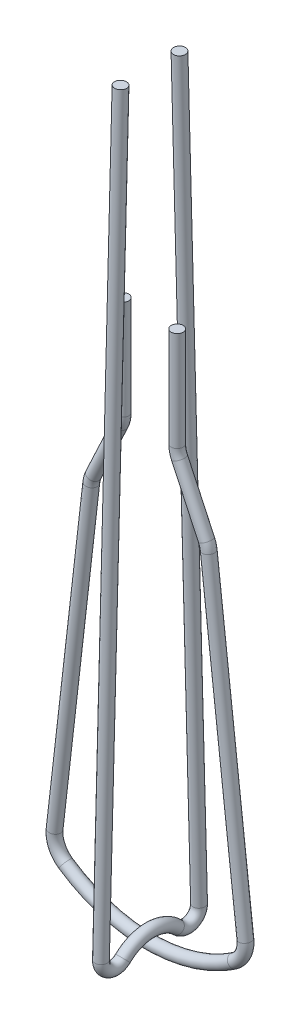
ISO-10303-21;
HEADER;
FILE_DESCRIPTION(('STEP AP214'),'2;1');
FILE_NAME('part.step','',(''),(''),'','','');
FILE_SCHEMA(('AUTOMOTIVE_DESIGN { 1 0 10303 214 1 1 1 1 }'));
ENDSEC;
DATA;
#1=APPLICATION_CONTEXT('core data for automotive mechanical design processes');
#2=APPLICATION_PROTOCOL_DEFINITION('international standard','automotive_design',2000,#1);
#3=PRODUCT_CONTEXT('',#1,'mechanical');
#4=PRODUCT('Part','Part','',(#3));
#5=PRODUCT_RELATED_PRODUCT_CATEGORY('part','',(#4));
#6=PRODUCT_DEFINITION_FORMATION('','',#4);
#7=PRODUCT_DEFINITION_CONTEXT('part definition',#1,'design');
#8=PRODUCT_DEFINITION('design','',#6,#7);
#9=PRODUCT_DEFINITION_SHAPE('','',#8);
#10=(LENGTH_UNIT() NAMED_UNIT(*) SI_UNIT(.MILLI.,.METRE.));
#11=(NAMED_UNIT(*) PLANE_ANGLE_UNIT() SI_UNIT($,.RADIAN.));
#12=(NAMED_UNIT(*) SI_UNIT($,.STERADIAN.) SOLID_ANGLE_UNIT());
#13=UNCERTAINTY_MEASURE_WITH_UNIT(LENGTH_MEASURE(1.E-05),#10,'distance_accuracy_value','');
#14=(GEOMETRIC_REPRESENTATION_CONTEXT(3) GLOBAL_UNCERTAINTY_ASSIGNED_CONTEXT((#13)) GLOBAL_UNIT_ASSIGNED_CONTEXT((#10,
#11,#12)) REPRESENTATION_CONTEXT('',''));
#15=CARTESIAN_POINT('',(0.,0.,0.));
#16=DIRECTION('',(0.,0.,1.));
#17=DIRECTION('',(1.,0.,0.));
#18=AXIS2_PLACEMENT_3D('',#15,#16,#17);
#19=CARTESIAN_POINT('',(6.66749999999998,-5.11109615793453,0.));
#20=DIRECTION('',(0.,1.,0.));
#21=DIRECTION('',(-1.,0.,0.));
#22=AXIS2_PLACEMENT_3D('',#19,#20,#21);
#23=CYLINDRICAL_SURFACE('',#22,1.4605);
#24=CARTESIAN_POINT('',(6.66749999999998,-5.11109615793453,0.));
#25=DIRECTION('',(0.,1.,0.));
#26=DIRECTION('',(-1.,0.,0.));
#27=AXIS2_PLACEMENT_3D('',#24,#25,#26);
#28=CIRCLE('',#27,1.4605);
#29=CARTESIAN_POINT('',(5.20699999999998,-5.11109615793453,0.));
#30=VERTEX_POINT('',#29);
#31=EDGE_CURVE('E49',#30,#30,#28,.T.);
#32=ORIENTED_EDGE('',*,*,#31,.T.);
#33=EDGE_LOOP('',(#32));
#34=FACE_BOUND('',#33,.T.);
#35=CARTESIAN_POINT('',(6.66749999999998,19.2995920488355,0.));
#36=DIRECTION('',(0.,1.,0.));
#37=DIRECTION('',(-1.,0.,0.));
#38=AXIS2_PLACEMENT_3D('',#35,#36,#37);
#39=CIRCLE('',#38,1.4605);
#40=CARTESIAN_POINT('',(5.20699999999998,19.2995920488355,0.));
#41=VERTEX_POINT('',#40);
#42=EDGE_CURVE('E45',#41,#41,#39,.T.);
#43=ORIENTED_EDGE('',*,*,#42,.F.);
#44=EDGE_LOOP('',(#43));
#45=FACE_BOUND('',#44,.T.);
#46=ADVANCED_FACE('F34',(#34,#45),#23,.T.);
#47=CARTESIAN_POINT('',(13.0175,-5.11109615793455,0.));
#48=DIRECTION('',(0.,0.,-1.));
#49=DIRECTION('',(-1.,0.,0.));
#50=AXIS2_PLACEMENT_3D('',#47,#48,#49);
#51=TOROIDAL_SURFACE('',#50,6.35000000000002,1.4605);
#52=CARTESIAN_POINT('',(7.26244555231727,-7.79472211998803,0.));
#53=DIRECTION('',(-0.422618261740708,0.906307787036646,0.));
#54=DIRECTION('',(-0.906307787036646,-0.422618261740708,0.));
#55=AXIS2_PLACEMENT_3D('',#52,#53,#54);
#56=CIRCLE('',#55,1.4605);
#57=CARTESIAN_POINT('',(5.93878302935025,-8.41195609126033,0.));
#58=VERTEX_POINT('',#57);
#59=EDGE_CURVE('E53',#58,#58,#56,.T.);
#60=CARTESIAN_POINT('',(13.0175,-5.11109615793455,0.));
#61=DIRECTION('',(0.,0.,-1.));
#62=DIRECTION('',(-1.,0.,0.));
#63=AXIS2_PLACEMENT_3D('',#60,#61,#62);
#64=CIRCLE('',#63,7.81050000000002);
#65=EDGE_CURVE('',#58,#30,#64,.T.);
#66=ORIENTED_EDGE('',*,*,#59,.T.);
#67=ORIENTED_EDGE('',*,*,#31,.F.);
#68=ORIENTED_EDGE('',*,*,#65,.T.);
#69=ORIENTED_EDGE('',*,*,#65,.F.);
#70=EDGE_LOOP('',(#66,#68,#67,#69));
#71=FACE_BOUND('',#70,.T.);
#72=ADVANCED_FACE('F122',(#71),#51,.T.);
#73=CARTESIAN_POINT('',(13.8521167546719,-21.9263176173201,0.));
#74=DIRECTION('',(-0.422618261740701,0.906307787036649,0.));
#75=DIRECTION('',(-0.906307787036649,-0.422618261740701,0.));
#76=AXIS2_PLACEMENT_3D('',#73,#74,#75);
#77=CYLINDRICAL_SURFACE('',#76,1.4605);
#78=CARTESIAN_POINT('',(13.8521167546719,-21.9263176173201,0.));
#79=DIRECTION('',(-0.422618261740708,0.906307787036646,0.));
#80=DIRECTION('',(-0.906307787036646,-0.422618261740708,0.));
#81=AXIS2_PLACEMENT_3D('',#78,#79,#80);
#82=CIRCLE('',#81,1.4605);
#83=CARTESIAN_POINT('',(15.1757792776389,-21.3090836460478,0.));
#84=VERTEX_POINT('',#83);
#85=EDGE_CURVE('E58',#84,#84,#82,.T.);
#86=ORIENTED_EDGE('',*,*,#85,.T.);
#87=EDGE_LOOP('',(#86));
#88=FACE_BOUND('',#87,.T.);
#89=ORIENTED_EDGE('',*,*,#59,.F.);
#90=EDGE_LOOP('',(#89));
#91=FACE_BOUND('',#90,.T.);
#92=ADVANCED_FACE('F127',(#88,#91),#77,.T.);
#93=CARTESIAN_POINT('',(8.09706230698922,-24.6099435793735,0.));
#94=DIRECTION('',(0.,0.,1.));
#95=DIRECTION('',(1.,0.,0.));
#96=AXIS2_PLACEMENT_3D('',#93,#94,#95);
#97=TOROIDAL_SURFACE('',#96,6.34999999999999,1.4605);
#98=CARTESIAN_POINT('',(14.4053657446367,-23.8834398019818,0.));
#99=DIRECTION('',(-0.114410043683738,0.993433612227956,0.));
#100=DIRECTION('',(-0.993433612227956,-0.114410043683738,0.));
#101=AXIS2_PLACEMENT_3D('',#98,#99,#100);
#102=CIRCLE('',#101,1.4605);
#103=CARTESIAN_POINT('',(15.8562755352957,-23.7163439331817,0.));
#104=VERTEX_POINT('',#103);
#105=EDGE_CURVE('E61',#104,#104,#102,.T.);
#106=CARTESIAN_POINT('',(8.09706230698922,-24.6099435793735,0.));
#107=DIRECTION('',(0.,0.,1.));
#108=DIRECTION('',(1.,0.,0.));
#109=AXIS2_PLACEMENT_3D('',#106,#107,#108);
#110=CIRCLE('',#109,7.81049999999999);
#111=EDGE_CURVE('',#104,#84,#110,.T.);
#112=ORIENTED_EDGE('',*,*,#105,.T.);
#113=ORIENTED_EDGE('',*,*,#85,.F.);
#114=ORIENTED_EDGE('',*,*,#111,.T.);
#115=ORIENTED_EDGE('',*,*,#111,.F.);
#116=EDGE_LOOP('',(#112,#114,#113,#115));
#117=FACE_BOUND('',#116,.T.);
#118=ADVANCED_FACE('F135',(#117),#97,.T.);
#119=CARTESIAN_POINT('',(23.3995437744841,-101.980768336458,0.));
#120=DIRECTION('',(-0.114410043683737,0.993433612227956,0.));
#121=DIRECTION('',(-0.993433612227956,-0.114410043683737,0.));
#122=AXIS2_PLACEMENT_3D('',#119,#120,#121);
#123=CYLINDRICAL_SURFACE('',#122,1.4605);
#124=CARTESIAN_POINT('',(23.3995437744841,-101.980768336458,0.));
#125=DIRECTION('',(-0.114410043683738,0.993433612227956,0.));
#126=DIRECTION('',(-0.993433612227956,-0.114410043683738,0.));
#127=AXIS2_PLACEMENT_3D('',#124,#125,#126);
#128=CIRCLE('',#127,1.4605);
#129=CARTESIAN_POINT('',(24.850453565143,-101.813672467658,0.));
#130=VERTEX_POINT('',#129);
#131=EDGE_CURVE('E64',#130,#130,#128,.T.);
#132=ORIENTED_EDGE('',*,*,#131,.T.);
#133=EDGE_LOOP('',(#132));
#134=FACE_BOUND('',#133,.T.);
#135=ORIENTED_EDGE('',*,*,#105,.F.);
#136=EDGE_LOOP('',(#135));
#137=FACE_BOUND('',#136,.T.);
#138=ADVANCED_FACE('F141',(#134,#137),#123,.T.);
#139=CARTESIAN_POINT('',(17.0912403368366,-102.70727211385,0.));
#140=DIRECTION('',(0.,0.,1.));
#141=DIRECTION('',(1.,0.,0.));
#142=AXIS2_PLACEMENT_3D('',#139,#140,#141);
#143=TOROIDAL_SURFACE('',#142,6.35,1.4605);
#144=CARTESIAN_POINT('',(20.6519154070108,-107.965037137568,0.));
#145=DIRECTION('',(0.8279944919242,0.560736231523508,0.));
#146=DIRECTION('',(-0.560736231523508,0.8279944919242,0.));
#147=AXIS2_PLACEMENT_3D('',#144,#145,#146);
#148=CIRCLE('',#147,1.4605);
#149=CARTESIAN_POINT('',(21.4708706731509,-109.174323093024,0.));
#150=VERTEX_POINT('',#149);
#151=EDGE_CURVE('E67',#150,#150,#148,.T.);
#152=CARTESIAN_POINT('',(17.0912403368366,-102.70727211385,0.));
#153=DIRECTION('',(0.,0.,1.));
#154=DIRECTION('',(1.,0.,0.));
#155=AXIS2_PLACEMENT_3D('',#152,#153,#154);
#156=CIRCLE('',#155,7.8105);
#157=EDGE_CURVE('',#150,#130,#156,.T.);
#158=ORIENTED_EDGE('',*,*,#151,.T.);
#159=ORIENTED_EDGE('',*,*,#131,.F.);
#160=ORIENTED_EDGE('',*,*,#157,.T.);
#161=ORIENTED_EDGE('',*,*,#157,.F.);
#162=EDGE_LOOP('',(#158,#160,#159,#161));
#163=FACE_BOUND('',#162,.T.);
#164=ADVANCED_FACE('F145',(#163),#143,.T.);
#165=CARTESIAN_POINT('',(0.,-77.47,0.));
#166=DIRECTION('',(0.,0.,1.));
#167=DIRECTION('',(1.,0.,0.));
#168=AXIS2_PLACEMENT_3D('',#165,#166,#167);
#169=TOROIDAL_SURFACE('',#168,36.83,1.4605);
#170=CARTESIAN_POINT('',(-0.651045295628982,-113.11229995499,-0.858205278634517));
#171=CARTESIAN_POINT('',(-0.69147082869026,-113.088762805004,-0.826812490830685));
#172=CARTESIAN_POINT('',(-0.72846681754543,-113.064384018319,-0.791627126541751));
#173=CARTESIAN_POINT('',(-0.795055861514501,-113.016457367342,-0.71436035391035));
#174=CARTESIAN_POINT('',(-0.824646039708867,-112.992909829004,-0.67227627611316));
#175=CARTESIAN_POINT('',(-0.876399087503064,-112.948958491328,-0.582504096533718));
#176=CARTESIAN_POINT('',(-0.898581888683831,-112.928546336724,-0.534831507490377));
#177=CARTESIAN_POINT('',(-0.93605397308013,-112.892480342385,-0.435182012874369));
#178=CARTESIAN_POINT('',(-0.951342085701186,-112.876827310812,-0.383204378153987));
#179=CARTESIAN_POINT('',(-0.975632473336324,-112.851290461298,-0.275934757695994));
#180=CARTESIAN_POINT('',(-0.984577445886467,-112.841459365297,-0.220617337662018));
#181=CARTESIAN_POINT('',(-0.996345652479665,-112.82841459167,-0.108568282314303));
#182=CARTESIAN_POINT('',(-0.999167790629584,-112.825202098678,-0.0518363956704946));
#183=CARTESIAN_POINT('',(-0.998815028636838,-112.825601595735,0.064265768805131));
#184=CARTESIAN_POINT('',(-0.995351581220222,-112.829541947676,0.123634535359745));
#185=CARTESIAN_POINT('',(-0.98167694525096,-112.844640635866,0.240664987593286));
#186=CARTESIAN_POINT('',(-0.971464982444661,-112.855799800323,0.298326476603971));
#187=CARTESIAN_POINT('',(-0.943810280292854,-112.884550038711,0.410268641356711));
#188=CARTESIAN_POINT('',(-0.926362971526499,-112.902145176397,0.464547155647371));
#189=CARTESIAN_POINT('',(-0.883640906480225,-112.94231691018,0.567933414163165));
#190=CARTESIAN_POINT('',(-0.858369806006674,-112.964891178275,0.617043559070087));
#191=CARTESIAN_POINT('',(-0.800965825616253,-113.011722362515,0.706354910194595));
#192=CARTESIAN_POINT('',(-0.769211315891906,-113.035850310056,0.746866372060954));
#193=CARTESIAN_POINT('',(-0.698307116775892,-113.084263438862,0.820679261267494));
#194=CARTESIAN_POINT('',(-0.65916067944386,-113.108548546462,0.85398384547964));
#195=CARTESIAN_POINT('',(-0.576840393761461,-113.153296218672,0.911020278072546));
#196=CARTESIAN_POINT('',(-0.534065654143044,-113.173902330892,0.935216956894676));
#197=CARTESIAN_POINT('',(-0.443725316041793,-113.211126081211,0.97678105408651));
#198=CARTESIAN_POINT('',(-0.396159612384144,-113.227743631723,0.994148322490842));
#199=CARTESIAN_POINT('',(-0.298777564433516,-113.255228984226,1.02196551275163));
#200=CARTESIAN_POINT('',(-0.249039796415132,-113.266222082568,1.03256760837897));
#201=CARTESIAN_POINT('',(-0.147713881241383,-113.28220430345,1.04776778385888));
#202=CARTESIAN_POINT('',(-0.09612556595964,-113.287192879035,1.0523653167567));
#203=CARTESIAN_POINT('',(0.00789937491964724,-113.290821749327,1.05572288266348));
#204=CARTESIAN_POINT('',(0.0603394855751055,-113.289408149878,1.05443335709093));
#205=CARTESIAN_POINT('',(0.164160200708821,-113.280210511216,1.04585736349767));
#206=CARTESIAN_POINT('',(0.215540830811867,-113.272426626262,1.03857104069139));
#207=CARTESIAN_POINT('',(0.315922143137794,-113.251036351683,1.01774229885599));
#208=CARTESIAN_POINT('',(0.364915689501795,-113.237413570287,1.00418225878696));
#209=CARTESIAN_POINT('',(0.458942159665289,-113.205442508434,0.970513822897834));
#210=CARTESIAN_POINT('',(0.503975971450437,-113.187095291095,0.950406900022405));
#211=CARTESIAN_POINT('',(0.588459404034104,-113.147462041193,0.903725577905325));
#212=CARTESIAN_POINT('',(0.627958993492534,-113.126206268876,0.877215862174047));
#213=CARTESIAN_POINT('',(0.701049315283054,-113.082510909661,0.817809891488066));
#214=CARTESIAN_POINT('',(0.734640084080518,-113.060071330069,0.784913675949298));
#215=CARTESIAN_POINT('',(0.795729865613737,-113.015825255733,0.713073105772885));
#216=CARTESIAN_POINT('',(0.823187457096616,-112.994023881641,0.674090479119321));
#217=CARTESIAN_POINT('',(0.871778338826817,-112.952992881568,0.591150578498355));
#218=CARTESIAN_POINT('',(0.892909745393786,-112.933764022518,0.54719182820275));
#219=CARTESIAN_POINT('',(0.930038449776739,-112.898450946855,0.453200285335705));
#220=CARTESIAN_POINT('',(0.9457391213397,-112.882563023274,0.40297683301857));
#221=CARTESIAN_POINT('',(0.971006224297309,-112.856257377948,0.299636366175325));
#222=CARTESIAN_POINT('',(0.980570561774897,-112.845841523671,0.246518370637743));
#223=CARTESIAN_POINT('',(0.994339664972427,-112.830677782045,0.135471070905462));
#224=CARTESIAN_POINT('',(0.998185747421985,-112.826310316106,0.0774449645847866));
#225=CARTESIAN_POINT('',(0.999587175503846,-112.824729936799,-0.038788990699196));
#226=CARTESIAN_POINT('',(0.997140927940185,-112.827518835396,-0.0969968819629377));
#227=CARTESIAN_POINT('',(0.985671833529262,-112.840258610064,-0.213653599767596));
#228=CARTESIAN_POINT('',(0.976465598716776,-112.85040909813,-0.272062991315541));
#229=CARTESIAN_POINT('',(0.950825217225995,-112.87737607712,-0.385676173687456));
#230=CARTESIAN_POINT('',(0.934392047908641,-112.894191666634,-0.4408803968317));
#231=CARTESIAN_POINT('',(0.894112417399395,-112.932719745627,-0.545242765229204));
#232=CARTESIAN_POINT('',(0.870425613961395,-112.95432424358,-0.594502019404782));
#233=CARTESIAN_POINT('',(0.81509011217072,-113.00063795234,-0.686675652358565));
#234=CARTESIAN_POINT('',(0.783446024367296,-113.025345361146,-0.729593682537948));
#235=CARTESIAN_POINT('',(0.714356366696795,-113.073790787894,-0.805500590254086));
#236=CARTESIAN_POINT('',(0.677374702781803,-113.097497627266,-0.838931654871156));
#237=CARTESIAN_POINT('',(0.596966343325901,-113.143039543091,-0.898532432845516));
#238=CARTESIAN_POINT('',(0.553541016923163,-113.164875015618,-0.924703685373586));
#239=CARTESIAN_POINT('',(0.463682236069252,-113.203528463483,-0.968572120550804));
#240=CARTESIAN_POINT('',(0.417506679606071,-113.220542310986,-0.986626723322663));
#241=CARTESIAN_POINT('',(0.321634091614191,-113.249505213969,-1.01632023130486));
#242=CARTESIAN_POINT('',(0.271936755513881,-113.26145383077,-1.02795858085681));
#243=CARTESIAN_POINT('',(0.170713150975095,-113.279304510382,-1.04505807825142));
#244=CARTESIAN_POINT('',(0.119197558898087,-113.285237242247,-1.05055057273936));
#245=CARTESIAN_POINT('',(0.0155371749267335,-113.290736674936,-1.05564797282792));
#246=CARTESIAN_POINT('',(-0.0366076560038358,-113.290302978755,-1.05525251126038));
#247=CARTESIAN_POINT('',(-0.140564379970266,-113.283064008161,-1.04852686173248));
#248=CARTESIAN_POINT('',(-0.192368527166851,-113.276198837062,-1.04214088300446));
#249=CARTESIAN_POINT('',(-0.293650673405555,-113.256520909202,-1.02314635803241));
#250=CARTESIAN_POINT('',(-0.343128940566271,-113.243708839837,-1.01053853095549));
#251=CARTESIAN_POINT('',(-0.438773087372408,-113.213015207474,-0.978660415577097));
#252=CARTESIAN_POINT('',(-0.484904598103566,-113.19508842515,-0.959330346198818));
#253=CARTESIAN_POINT('',(-0.572048373836677,-113.155788708024,-0.913851288390274));
#254=CARTESIAN_POINT('',(-0.613060773251239,-113.13441586374,-0.887702479055519));
#255=CARTESIAN_POINT('',(-0.651045295628982,-113.11229995499,-0.858205278634517));
#256=B_SPLINE_CURVE_WITH_KNOTS('',3,(#170,#171,#172,#173,#174,#175,#176,#177,#178,#179,#180,
#181,#182,#183,#184,#185,#186,#187,#188,#189,#190,#191,#192,#193,#194,#195,#196,#197,#198,#199,
#200,#201,#202,#203,#204,#205,#206,#207,#208,#209,#210,#211,#212,#213,#214,#215,#216,#217,#218,
#219,#220,#221,#222,#223,#224,#225,#226,#227,#228,#229,#230,#231,#232,#233,#234,#235,#236,#237,
#238,#239,#240,#241,#242,#243,#244,#245,#246,#247,#248,#249,#250,#251,#252,#253,#254,#255),
.UNSPECIFIED.,.T.,.F.,(4,2,2,2,2,2,2,2,2,2,2,2,2,2,2,2,2,2,2,2,2,2,2,2,2,2,2,2,2,2,2,2,2,2,2,2,
2,2,2,2,2,2,4),(0.,0.168791187386801,0.337647843307991,0.506046412328823,0.674473561653062,
0.844403501597295,1.01436385387754,1.19232461973774,1.37030580648936,1.54839956732909,
1.72641023595913,1.89605358034868,2.06562246374238,2.22469850933225,2.3837780478395,
2.539139880973,2.6945158650065,2.85120223949999,3.00788481989277,3.16501017271754,
3.32210019923134,3.47766514382601,3.63322912834196,3.78981394125898,3.94644533249189,
4.11062786125154,4.27486638468239,4.44902675274224,4.62323122193892,4.80234482699792,
4.98143421641834,5.15683502050447,5.33213442842254,5.49688122615219,5.66159306876221,
5.81809335504138,5.97460719238201,6.13031904680117,6.2860406113257,6.44322699058692,
6.60039520534155,6.75899845765327,6.91759754463973),.UNSPECIFIED.);
#257=CARTESIAN_POINT('',(-0.651045295628982,-113.11229995499,-0.858205278634517));
#258=VERTEX_POINT('',#257);
#259=EDGE_CURVE('E10',#258,#258,#256,.T.);
#260=ORIENTED_EDGE('',*,*,#259,.F.);
#261=EDGE_LOOP('',(#260));
#262=FACE_BOUND('',#261,.T.);
#263=CARTESIAN_POINT('',(-20.6519154070108,-107.965037137568,0.));
#264=DIRECTION('',(0.827994491924199,-0.56073623152351,0.));
#265=DIRECTION('',(0.56073623152351,0.827994491924199,0.));
#266=AXIS2_PLACEMENT_3D('',#263,#264,#265);
#267=CIRCLE('',#266,1.4605);
#268=CARTESIAN_POINT('',(-21.4708706731509,-109.174323093024,0.));
#269=VERTEX_POINT('',#268);
#270=EDGE_CURVE('E70',#269,#269,#267,.T.);
#271=ORIENTED_EDGE('',*,*,#270,.T.);
#272=EDGE_LOOP('',(#271));
#273=FACE_BOUND('',#272,.T.);
#274=ORIENTED_EDGE('',*,*,#151,.F.);
#275=EDGE_LOOP('',(#274));
#276=FACE_BOUND('',#275,.T.);
#277=ADVANCED_FACE('F148',(#262,#273,#276),#169,.T.);
#278=CARTESIAN_POINT('',(-17.0912403368365,-102.70727211385,0.));
#279=DIRECTION('',(0.,0.,1.));
#280=DIRECTION('',(1.,0.,0.));
#281=AXIS2_PLACEMENT_3D('',#278,#279,#280);
#282=TOROIDAL_SURFACE('',#281,6.34999999999999,1.4605);
#283=CARTESIAN_POINT('',(-23.3995437744841,-101.980768336458,0.));
#284=DIRECTION('',(-0.114410043683737,-0.993433612227956,0.));
#285=DIRECTION('',(0.993433612227956,-0.114410043683737,0.));
#286=AXIS2_PLACEMENT_3D('',#283,#284,#285);
#287=CIRCLE('',#286,1.4605);
#288=CARTESIAN_POINT('',(-24.850453565143,-101.813672467658,0.));
#289=VERTEX_POINT('',#288);
#290=EDGE_CURVE('E73',#289,#289,#287,.T.);
#291=CARTESIAN_POINT('',(-17.0912403368365,-102.70727211385,0.));
#292=DIRECTION('',(0.,0.,1.));
#293=DIRECTION('',(1.,0.,0.));
#294=AXIS2_PLACEMENT_3D('',#291,#292,#293);
#295=CIRCLE('',#294,7.81049999999999);
#296=EDGE_CURVE('',#289,#269,#295,.T.);
#297=ORIENTED_EDGE('',*,*,#290,.T.);
#298=ORIENTED_EDGE('',*,*,#270,.F.);
#299=ORIENTED_EDGE('',*,*,#296,.T.);
#300=ORIENTED_EDGE('',*,*,#296,.F.);
#301=EDGE_LOOP('',(#297,#299,#298,#300));
#302=FACE_BOUND('',#301,.T.);
#303=ADVANCED_FACE('F153',(#302),#282,.T.);
#304=CARTESIAN_POINT('',(-14.4053657446367,-23.8834398019818,0.));
#305=DIRECTION('',(-0.114410043683737,-0.993433612227956,0.));
#306=DIRECTION('',(0.993433612227956,-0.114410043683737,0.));
#307=AXIS2_PLACEMENT_3D('',#304,#305,#306);
#308=CYLINDRICAL_SURFACE('',#307,1.4605);
#309=CARTESIAN_POINT('',(-14.4053657446367,-23.8834398019818,0.));
#310=DIRECTION('',(-0.114410043683737,-0.993433612227956,0.));
#311=DIRECTION('',(0.993433612227956,-0.114410043683737,0.));
#312=AXIS2_PLACEMENT_3D('',#309,#310,#311);
#313=CIRCLE('',#312,1.4605);
#314=CARTESIAN_POINT('',(-15.8562755352957,-23.7163439331817,0.));
#315=VERTEX_POINT('',#314);
#316=EDGE_CURVE('E76',#315,#315,#313,.T.);
#317=ORIENTED_EDGE('',*,*,#316,.T.);
#318=EDGE_LOOP('',(#317));
#319=FACE_BOUND('',#318,.T.);
#320=ORIENTED_EDGE('',*,*,#290,.F.);
#321=EDGE_LOOP('',(#320));
#322=FACE_BOUND('',#321,.T.);
#323=ADVANCED_FACE('F157',(#319,#322),#308,.T.);
#324=CARTESIAN_POINT('',(-8.09706230698921,-24.6099435793735,0.));
#325=DIRECTION('',(0.,0.,1.));
#326=DIRECTION('',(1.,0.,0.));
#327=AXIS2_PLACEMENT_3D('',#324,#325,#326);
#328=TOROIDAL_SURFACE('',#327,6.35,1.4605);
#329=CARTESIAN_POINT('',(-13.8521167546719,-21.92631761732,0.));
#330=DIRECTION('',(-0.422618261740707,-0.906307787036646,0.));
#331=DIRECTION('',(0.906307787036646,-0.422618261740707,0.));
#332=AXIS2_PLACEMENT_3D('',#329,#330,#331);
#333=CIRCLE('',#332,1.4605);
#334=CARTESIAN_POINT('',(-15.1757792776389,-21.3090836460477,0.));
#335=VERTEX_POINT('',#334);
#336=EDGE_CURVE('E79',#335,#335,#333,.T.);
#337=CARTESIAN_POINT('',(-8.09706230698921,-24.6099435793735,0.));
#338=DIRECTION('',(0.,0.,1.));
#339=DIRECTION('',(1.,0.,0.));
#340=AXIS2_PLACEMENT_3D('',#337,#338,#339);
#341=CIRCLE('',#340,7.8105);
#342=EDGE_CURVE('',#335,#315,#341,.T.);
#343=ORIENTED_EDGE('',*,*,#336,.T.);
#344=ORIENTED_EDGE('',*,*,#316,.F.);
#345=ORIENTED_EDGE('',*,*,#342,.T.);
#346=ORIENTED_EDGE('',*,*,#342,.F.);
#347=EDGE_LOOP('',(#343,#345,#344,#346));
#348=FACE_BOUND('',#347,.T.);
#349=ADVANCED_FACE('F161',(#348),#328,.T.);
#350=CARTESIAN_POINT('',(-7.26244555231728,-7.79472211998801,0.));
#351=DIRECTION('',(-0.422618261740701,-0.906307787036649,0.));
#352=DIRECTION('',(0.906307787036649,-0.422618261740701,0.));
#353=AXIS2_PLACEMENT_3D('',#350,#351,#352);
#354=CYLINDRICAL_SURFACE('',#353,1.4605);
#355=CARTESIAN_POINT('',(-7.26244555231728,-7.79472211998801,0.));
#356=DIRECTION('',(-0.422618261740707,-0.906307787036646,0.));
#357=DIRECTION('',(0.906307787036646,-0.422618261740707,0.));
#358=AXIS2_PLACEMENT_3D('',#355,#356,#357);
#359=CIRCLE('',#358,1.4605);
#360=CARTESIAN_POINT('',(-5.93878302935026,-8.41195609126031,0.));
#361=VERTEX_POINT('',#360);
#362=EDGE_CURVE('E82',#361,#361,#359,.T.);
#363=ORIENTED_EDGE('',*,*,#362,.T.);
#364=EDGE_LOOP('',(#363));
#365=FACE_BOUND('',#364,.T.);
#366=ORIENTED_EDGE('',*,*,#336,.F.);
#367=EDGE_LOOP('',(#366));
#368=FACE_BOUND('',#367,.T.);
#369=ADVANCED_FACE('F165',(#365,#368),#354,.T.);
#370=CARTESIAN_POINT('',(-13.0175,-5.11109615793455,0.));
#371=DIRECTION('',(0.,0.,-1.));
#372=DIRECTION('',(-1.,0.,0.));
#373=AXIS2_PLACEMENT_3D('',#370,#371,#372);
#374=TOROIDAL_SURFACE('',#373,6.35,1.4605);
#375=CARTESIAN_POINT('',(-6.6675,-5.11109615793452,0.));
#376=DIRECTION('',(0.,-1.,0.));
#377=DIRECTION('',(1.,0.,0.));
#378=AXIS2_PLACEMENT_3D('',#375,#376,#377);
#379=CIRCLE('',#378,1.4605);
#380=CARTESIAN_POINT('',(-5.207,-5.11109615793452,0.));
#381=VERTEX_POINT('',#380);
#382=EDGE_CURVE('E85',#381,#381,#379,.T.);
#383=CARTESIAN_POINT('',(-13.0175,-5.11109615793455,0.));
#384=DIRECTION('',(0.,0.,-1.));
#385=DIRECTION('',(-1.,0.,0.));
#386=AXIS2_PLACEMENT_3D('',#383,#384,#385);
#387=CIRCLE('',#386,7.8105);
#388=EDGE_CURVE('',#381,#361,#387,.T.);
#389=ORIENTED_EDGE('',*,*,#382,.T.);
#390=ORIENTED_EDGE('',*,*,#362,.F.);
#391=ORIENTED_EDGE('',*,*,#388,.T.);
#392=ORIENTED_EDGE('',*,*,#388,.F.);
#393=EDGE_LOOP('',(#389,#391,#390,#392));
#394=FACE_BOUND('',#393,.T.);
#395=ADVANCED_FACE('F169',(#394),#374,.T.);
#396=CARTESIAN_POINT('',(-6.6675,-5.11109615793452,0.));
#397=DIRECTION('',(0.,1.,0.));
#398=DIRECTION('',(-1.,0.,0.));
#399=AXIS2_PLACEMENT_3D('',#396,#397,#398);
#400=CYLINDRICAL_SURFACE('',#399,1.4605);
#401=ORIENTED_EDGE('',*,*,#382,.F.);
#402=EDGE_LOOP('',(#401));
#403=FACE_BOUND('',#402,.T.);
#404=CARTESIAN_POINT('',(-6.6675,19.2995920488355,0.));
#405=DIRECTION('',(0.,-1.,0.));
#406=DIRECTION('',(1.,0.,0.));
#407=AXIS2_PLACEMENT_3D('',#404,#405,#406);
#408=CIRCLE('',#407,1.4605);
#409=CARTESIAN_POINT('',(-5.207,19.2995920488355,0.));
#410=VERTEX_POINT('',#409);
#411=EDGE_CURVE('E88',#410,#410,#408,.T.);
#412=ORIENTED_EDGE('',*,*,#411,.T.);
#413=EDGE_LOOP('',(#412));
#414=FACE_BOUND('',#413,.T.);
#415=ADVANCED_FACE('F173',(#403,#414),#400,.T.);
#416=CARTESIAN_POINT('',(6.66749999999998,19.2995920488355,0.));
#417=DIRECTION('',(0.,1.,0.));
#418=DIRECTION('',(-1.,0.,0.));
#419=AXIS2_PLACEMENT_3D('',#416,#417,#418);
#420=PLANE('',#419);
#421=ORIENTED_EDGE('',*,*,#42,.T.);
#422=EDGE_LOOP('',(#421));
#423=FACE_BOUND('',#422,.T.);
#424=ADVANCED_FACE('F177',(#423),#420,.T.);
#425=CARTESIAN_POINT('',(-6.6675,19.2995920488355,0.));
#426=DIRECTION('',(0.,-1.,0.));
#427=DIRECTION('',(1.,0.,0.));
#428=AXIS2_PLACEMENT_3D('',#425,#426,#427);
#429=PLANE('',#428);
#430=ORIENTED_EDGE('',*,*,#411,.F.);
#431=EDGE_LOOP('',(#430));
#432=FACE_BOUND('',#431,.T.);
#433=ADVANCED_FACE('F181',(#432),#429,.F.);
#434=CARTESIAN_POINT('',(0.,-112.103356377706,-12.0343137401643));
#435=DIRECTION('',(0.,0.999657324975557,0.0261769483078732));
#436=DIRECTION('',(0.,-0.0261769483078732,0.999657324975557));
#437=AXIS2_PLACEMENT_3D('',#434,#435,#436);
#438=CYLINDRICAL_SURFACE('',#437,1.4605);
#439=CARTESIAN_POINT('',(0.,-112.103356377706,-12.0343137401643));
#440=DIRECTION('',(0.,0.999657324975557,0.0261769483078672));
#441=DIRECTION('',(0.,-0.0261769483078671,0.999657324975558));
#442=AXIS2_PLACEMENT_3D('',#439,#440,#441);
#443=CIRCLE('',#442,1.4605);
#444=CARTESIAN_POINT('',(0.,-112.065124944703,-13.4943132632911));
#445=VERTEX_POINT('',#444);
#446=EDGE_CURVE('E94',#445,#445,#443,.T.);
#447=ORIENTED_EDGE('',*,*,#446,.T.);
#448=EDGE_LOOP('',(#447));
#449=FACE_BOUND('',#448,.T.);
#450=CARTESIAN_POINT('',(0.,71.374,-7.22979007633588));
#451=DIRECTION('',(0.,0.999657324975557,0.0261769483078672));
#452=DIRECTION('',(0.,-0.0261769483078671,0.999657324975558));
#453=AXIS2_PLACEMENT_3D('',#450,#451,#452);
#454=CIRCLE('',#453,1.4605);
#455=CARTESIAN_POINT('',(0.,71.3357685669964,-5.76979055320908));
#456=VERTEX_POINT('',#455);
#457=EDGE_CURVE('E91',#456,#456,#454,.T.);
#458=ORIENTED_EDGE('',*,*,#457,.F.);
#459=EDGE_LOOP('',(#458));
#460=FACE_BOUND('',#459,.T.);
#461=ADVANCED_FACE('F184',(#449,#460),#438,.T.);
#462=CARTESIAN_POINT('',(0.,-112.186468188584,-8.86040173336687));
#463=DIRECTION('',(1.,0.,0.));
#464=DIRECTION('',(0.,0.,-1.));
#465=AXIS2_PLACEMENT_3D('',#462,#463,#464);
#466=TOROIDAL_SURFACE('',#465,3.175,1.4605);
#467=CARTESIAN_POINT('',(0.,-114.461101141438,-6.64530130002516));
#468=DIRECTION('',(0.,-0.697669427824166,-0.716419827670551));
#469=DIRECTION('',(0.,0.716419827670551,-0.697669427824166));
#470=AXIS2_PLACEMENT_3D('',#467,#468,#469);
#471=CIRCLE('',#470,1.4605);
#472=CARTESIAN_POINT('',(0.,-115.507432299751,-5.62635510068798));
#473=VERTEX_POINT('',#472);
#474=EDGE_CURVE('E97',#473,#473,#471,.T.);
#475=CARTESIAN_POINT('',(0.,-112.186468188584,-8.86040173336687));
#476=DIRECTION('',(1.,0.,0.));
#477=DIRECTION('',(0.,0.,-1.));
#478=AXIS2_PLACEMENT_3D('',#475,#476,#477);
#479=CIRCLE('',#478,4.6355);
#480=EDGE_CURVE('',#473,#445,#479,.T.);
#481=ORIENTED_EDGE('',*,*,#474,.T.);
#482=ORIENTED_EDGE('',*,*,#446,.F.);
#483=ORIENTED_EDGE('',*,*,#480,.T.);
#484=ORIENTED_EDGE('',*,*,#480,.F.);
#485=EDGE_LOOP('',(#481,#483,#482,#484));
#486=FACE_BOUND('',#485,.T.);
#487=ADVANCED_FACE('F188',(#486),#466,.T.);
#488=CARTESIAN_POINT('',(0.,-121.285,0.));
#489=DIRECTION('',(-1.,0.,0.));
#490=DIRECTION('',(0.,0.,1.));
#491=AXIS2_PLACEMENT_3D('',#488,#489,#490);
#492=TOROIDAL_SURFACE('',#491,9.525,1.4605);
#493=ORIENTED_EDGE('',*,*,#259,.T.);
#494=EDGE_LOOP('',(#493));
#495=FACE_BOUND('',#494,.T.);
#496=CARTESIAN_POINT('',(0.,-114.461101141438,6.64530130002515));
#497=DIRECTION('',(0.,0.697669427824162,-0.716419827670554));
#498=DIRECTION('',(0.,0.716419827670554,0.697669427824162));
#499=AXIS2_PLACEMENT_3D('',#496,#497,#498);
#500=CIRCLE('',#499,1.4605);
#501=CARTESIAN_POINT('',(0.,-115.507432299751,5.62635510068796));
#502=VERTEX_POINT('',#501);
#503=EDGE_CURVE('E100',#502,#502,#500,.T.);
#504=ORIENTED_EDGE('',*,*,#503,.T.);
#505=EDGE_LOOP('',(#504));
#506=FACE_BOUND('',#505,.T.);
#507=ORIENTED_EDGE('',*,*,#474,.F.);
#508=EDGE_LOOP('',(#507));
#509=FACE_BOUND('',#508,.T.);
#510=ADVANCED_FACE('F191',(#495,#506,#509),#492,.T.);
#511=CARTESIAN_POINT('',(0.,-112.186468188584,8.86040173336687));
#512=DIRECTION('',(1.,0.,0.));
#513=DIRECTION('',(0.,0.,-1.));
#514=AXIS2_PLACEMENT_3D('',#511,#512,#513);
#515=TOROIDAL_SURFACE('',#514,3.175,1.4605);
#516=CARTESIAN_POINT('',(0.,-112.103356377706,12.0343137401643));
#517=DIRECTION('',(0.,-0.999657324975557,0.0261769483078732));
#518=DIRECTION('',(0.,-0.0261769483078732,-0.999657324975557));
#519=AXIS2_PLACEMENT_3D('',#516,#517,#518);
#520=CIRCLE('',#519,1.4605);
#521=CARTESIAN_POINT('',(0.,-112.065124944703,13.4943132632911));
#522=VERTEX_POINT('',#521);
#523=EDGE_CURVE('E103',#522,#522,#520,.T.);
#524=CARTESIAN_POINT('',(0.,-112.186468188584,8.86040173336687));
#525=DIRECTION('',(1.,0.,0.));
#526=DIRECTION('',(0.,0.,-1.));
#527=AXIS2_PLACEMENT_3D('',#524,#525,#526);
#528=CIRCLE('',#527,4.6355);
#529=EDGE_CURVE('',#522,#502,#528,.T.);
#530=ORIENTED_EDGE('',*,*,#523,.T.);
#531=ORIENTED_EDGE('',*,*,#503,.F.);
#532=ORIENTED_EDGE('',*,*,#529,.T.);
#533=ORIENTED_EDGE('',*,*,#529,.F.);
#534=EDGE_LOOP('',(#530,#532,#531,#533));
#535=FACE_BOUND('',#534,.T.);
#536=ADVANCED_FACE('F196',(#535),#515,.T.);
#537=CARTESIAN_POINT('',(0.,-112.103356377706,12.0343137401643));
#538=DIRECTION('',(0.,0.999657324975557,-0.0261769483078732));
#539=DIRECTION('',(0.,0.0261769483078732,0.999657324975557));
#540=AXIS2_PLACEMENT_3D('',#537,#538,#539);
#541=CYLINDRICAL_SURFACE('',#540,1.4605);
#542=CARTESIAN_POINT('',(0.,71.374,7.22979007633588));
#543=DIRECTION('',(0.,-0.999657324975557,0.0261769483078732));
#544=DIRECTION('',(0.,-0.0261769483078732,-0.999657324975557));
#545=AXIS2_PLACEMENT_3D('',#542,#543,#544);
#546=CIRCLE('',#545,1.4605);
#547=CARTESIAN_POINT('',(0.,71.4122314330037,8.68978959946268));
#548=VERTEX_POINT('',#547);
#549=EDGE_CURVE('E106',#548,#548,#546,.T.);
#550=CARTESIAN_POINT('',(0.,-112.065124944703,13.4943132632911));
#551=CARTESIAN_POINT('',(0.,-110.153902482435,13.4442661417929));
#552=CARTESIAN_POINT('',(0.,-108.242680020167,13.3942190202946));
#553=CARTESIAN_POINT('',(0.,-104.420235095632,13.2941247772982));
#554=CARTESIAN_POINT('',(0.,-102.509012633364,13.2440776558));
#555=CARTESIAN_POINT('',(0.,-98.6865677088284,13.1439834128036));
#556=CARTESIAN_POINT('',(0.,-96.7753452465606,13.0939362913054));
#557=CARTESIAN_POINT('',(0.,-92.9529003220251,12.9938420483089));
#558=CARTESIAN_POINT('',(0.,-91.0416778597573,12.9437949268107));
#559=CARTESIAN_POINT('',(0.,-87.2192329352217,12.8437006838143));
#560=CARTESIAN_POINT('',(0.,-85.308010472954,12.7936535623161));
#561=CARTESIAN_POINT('',(0.,-81.4855655484184,12.6935593193197));
#562=CARTESIAN_POINT('',(0.,-79.5743430861506,12.6435121978215));
#563=CARTESIAN_POINT('',(0.,-75.7518981616151,12.543417954825));
#564=CARTESIAN_POINT('',(0.,-73.8406756993473,12.4933708333268));
#565=CARTESIAN_POINT('',(0.,-70.0182307748118,12.3932765903304));
#566=CARTESIAN_POINT('',(0.,-68.107008312544,12.3432294688322));
#567=CARTESIAN_POINT('',(0.,-64.2845633880084,12.2431352258358));
#568=CARTESIAN_POINT('',(0.,-62.3733409257406,12.1930881043375));
#569=CARTESIAN_POINT('',(0.,-58.5508960012051,12.0929938613411));
#570=CARTESIAN_POINT('',(0.,-56.6396735389373,12.0429467398429));
#571=CARTESIAN_POINT('',(0.,-52.8172286144018,11.9428524968465));
#572=CARTESIAN_POINT('',(0.,-50.906006152134,11.8928053753483));
#573=CARTESIAN_POINT('',(0.,-47.0835612275984,11.7927111323518));
#574=CARTESIAN_POINT('',(0.,-45.1723387653307,11.7426640108536));
#575=CARTESIAN_POINT('',(0.,-41.3498938407951,11.6425697678572));
#576=CARTESIAN_POINT('',(0.,-39.4386713785273,11.592522646359));
#577=CARTESIAN_POINT('',(0.,-35.6162264539918,11.4924284033626));
#578=CARTESIAN_POINT('',(0.,-33.705003991724,11.4423812818644));
#579=CARTESIAN_POINT('',(0.,-29.8825590671884,11.3422870388679));
#580=CARTESIAN_POINT('',(0.,-27.9713366049207,11.2922399173697));
#581=CARTESIAN_POINT('',(0.,-24.1488916803851,11.1921456743733));
#582=CARTESIAN_POINT('',(0.,-22.2376692181174,11.1420985528751));
#583=CARTESIAN_POINT('',(0.,-18.4152242935818,11.0420043098787));
#584=CARTESIAN_POINT('',(0.,-16.504001831314,10.9919571883805));
#585=CARTESIAN_POINT('',(0.,-12.6815569067785,10.891862945384));
#586=CARTESIAN_POINT('',(0.,-10.7703344445107,10.8418158238858));
#587=CARTESIAN_POINT('',(0.,-6.94788951997514,10.7417215808894));
#588=CARTESIAN_POINT('',(0.,-5.03666705770737,10.6916744593912));
#589=CARTESIAN_POINT('',(0.,-1.21422213317181,10.5915802163948));
#590=CARTESIAN_POINT('',(0.,0.697000329095967,10.5415330948965));
#591=CARTESIAN_POINT('',(0.,4.51944525363152,10.4414388519001));
#592=CARTESIAN_POINT('',(0.,6.4306677158993,10.3913917304019));
#593=CARTESIAN_POINT('',(0.,10.2531126404348,10.2912974874055));
#594=CARTESIAN_POINT('',(0.,12.1643351027026,10.2412503659073));
#595=CARTESIAN_POINT('',(0.,15.9867800272382,10.1411561229108));
#596=CARTESIAN_POINT('',(0.,17.8980024895059,10.0911090014126));
#597=CARTESIAN_POINT('',(0.,21.7204474140415,9.9910147584162));
#598=CARTESIAN_POINT('',(0.,23.6316698763093,9.94096763691799));
#599=CARTESIAN_POINT('',(0.,27.4541148008448,9.84087339392156));
#600=CARTESIAN_POINT('',(0.,29.3653372631126,9.79082627242335));
#601=CARTESIAN_POINT('',(0.,33.1877821876481,9.69073202942693));
#602=CARTESIAN_POINT('',(0.,35.0990046499159,9.64068490792872));
#603=CARTESIAN_POINT('',(0.,38.9214495744515,9.54059066493229));
#604=CARTESIAN_POINT('',(0.,40.8326720367192,9.49054354343408));
#605=CARTESIAN_POINT('',(0.,44.6551169612548,9.39044930043766));
#606=CARTESIAN_POINT('',(0.,46.5663394235226,9.34040217893944));
#607=CARTESIAN_POINT('',(0.,50.3887843480581,9.24030793594302));
#608=CARTESIAN_POINT('',(0.,52.3000068103259,9.1902608144448));
#609=CARTESIAN_POINT('',(0.,56.1224517348615,9.09016657144838));
#610=CARTESIAN_POINT('',(0.,58.0336741971292,9.04011944995017));
#611=CARTESIAN_POINT('',(0.,61.8561191216648,8.94002520695374));
#612=CARTESIAN_POINT('',(0.,63.7673415839325,8.88997808545553));
#613=CARTESIAN_POINT('',(0.,67.5897865084681,8.78988384245911));
#614=CARTESIAN_POINT('',(0.,69.5010089707359,8.73983672096089));
#615=CARTESIAN_POINT('',(0.,71.4122314330037,8.68978959946268));
#616=B_SPLINE_CURVE_WITH_KNOTS('',3,(#550,#551,#552,#553,#554,#555,#556,#557,#558,#559,#560,
#561,#562,#563,#564,#565,#566,#567,#568,#569,#570,#571,#572,#573,#574,#575,#576,#577,#578,#579,
#580,#581,#582,#583,#584,#585,#586,#587,#588,#589,#590,#591,#592,#593,#594,#595,#596,#597,#598,
#599,#600,#601,#602,#603,#604,#605,#606,#607,#608,#609,#610,#611,#612,#613,#614,#615),
.UNSPECIFIED.,.F.,.F.,(4,2,2,2,2,2,2,2,2,2,2,2,2,2,2,2,2,2,2,2,2,2,2,2,2,2,2,2,2,2,2,2,4),(0.,
5.73563284492867,11.4712656898573,17.206898534786,22.9425313797146,28.6781642246433,
34.4137970695719,40.1494299145006,45.8850627594293,51.6206956043579,57.3563284492866,
63.0919612942153,68.8275941391439,74.5632269840726,80.2988598290012,86.0344926739299,
91.7701255188586,97.5057583637872,103.241391208716,108.977024053645,114.712656898573,
120.448289743502,126.183922588431,131.919555433359,137.655188278288,143.390821123217,
149.126453968145,154.862086813074,160.597719658003,166.333352502931,172.06898534786,
177.804618192788,183.540251037717),.UNSPECIFIED.);
#617=EDGE_CURVE('BSEAM110',#522,#548,#616,.T.);
#618=ORIENTED_EDGE('',*,*,#523,.F.);
#619=ORIENTED_EDGE('',*,*,#549,.T.);
#620=ORIENTED_EDGE('',*,*,#617,.T.);
#621=ORIENTED_EDGE('',*,*,#617,.F.);
#622=EDGE_LOOP('',(#618,#620,#619,#621));
#623=FACE_BOUND('',#622,.T.);
#624=ADVANCED_FACE('F110',(#623),#541,.T.);
#625=CARTESIAN_POINT('',(0.,71.374,-7.22979007633588));
#626=DIRECTION('',(0.,0.999657324975557,0.0261769483078672));
#627=DIRECTION('',(0.,-0.0261769483078671,0.999657324975558));
#628=AXIS2_PLACEMENT_3D('',#625,#626,#627);
#629=PLANE('',#628);
#630=ORIENTED_EDGE('',*,*,#457,.T.);
#631=EDGE_LOOP('',(#630));
#632=FACE_BOUND('',#631,.T.);
#633=ADVANCED_FACE('F114',(#632),#629,.T.);
#634=CARTESIAN_POINT('',(0.,71.374,7.22979007633588));
#635=DIRECTION('',(0.,-0.999657324975557,0.0261769483078732));
#636=DIRECTION('',(0.,-0.0261769483078732,-0.999657324975557));
#637=AXIS2_PLACEMENT_3D('',#634,#635,#636);
#638=PLANE('',#637);
#639=ORIENTED_EDGE('',*,*,#549,.F.);
#640=EDGE_LOOP('',(#639));
#641=FACE_BOUND('',#640,.T.);
#642=ADVANCED_FACE('F112',(#641),#638,.F.);
#643=CLOSED_SHELL('',(#46,#72,#92,#118,#138,#164,#277,#303,#323,#349,#369,#395,#415,#424,#433,
#461,#487,#510,#536,#624,#633,#642));
#644=MANIFOLD_SOLID_BREP('B2',#643);
#645=ADVANCED_BREP_SHAPE_REPRESENTATION('',(#18,#644),#14);
#646=SHAPE_DEFINITION_REPRESENTATION(#9,#645);
ENDSEC;
END-ISO-10303-21;
